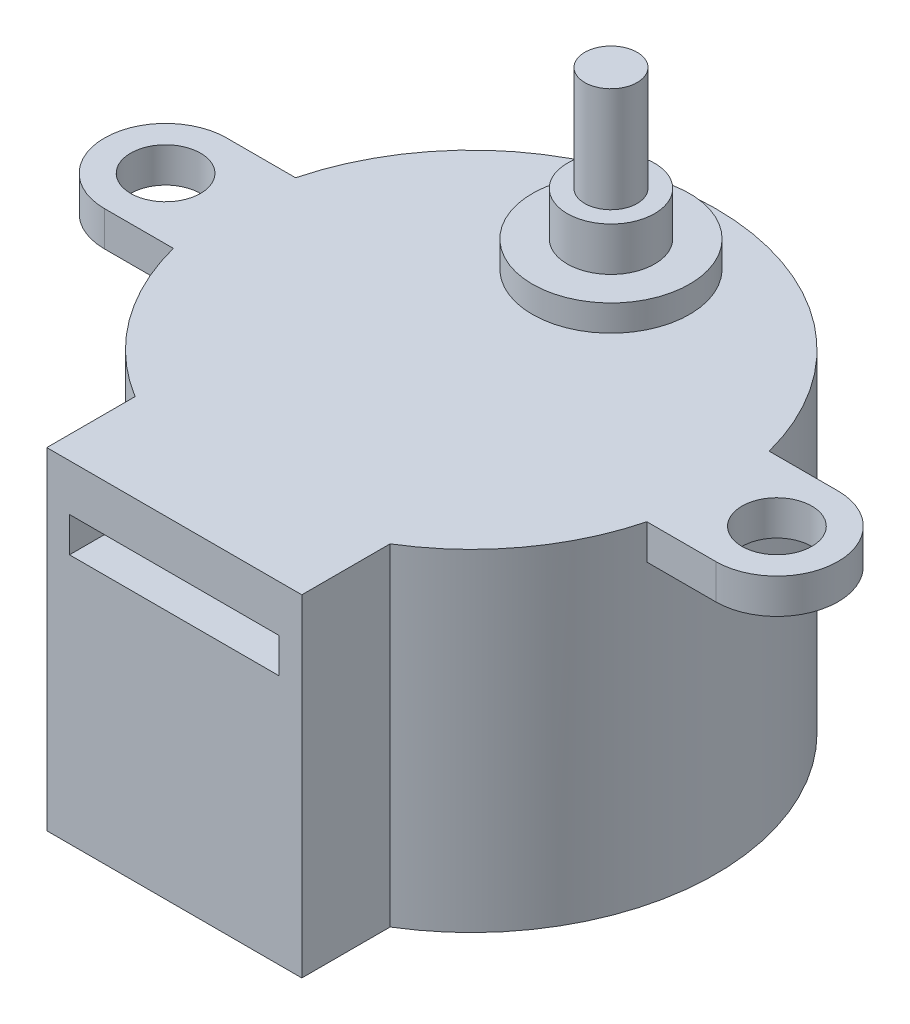
ISO-10303-21;
HEADER;
FILE_DESCRIPTION(('STEP AP214'),'2;1');
FILE_NAME('part.step','',(''),(''),'','','');
FILE_SCHEMA(('AUTOMOTIVE_DESIGN { 1 0 10303 214 1 1 1 1 }'));
ENDSEC;
DATA;
#1=APPLICATION_CONTEXT('core data for automotive mechanical design processes');
#2=APPLICATION_PROTOCOL_DEFINITION('international standard','automotive_design',2000,#1);
#3=PRODUCT_CONTEXT('',#1,'mechanical');
#4=PRODUCT('Part','Part','',(#3));
#5=PRODUCT_RELATED_PRODUCT_CATEGORY('part','',(#4));
#6=PRODUCT_DEFINITION_FORMATION('','',#4);
#7=PRODUCT_DEFINITION_CONTEXT('part definition',#1,'design');
#8=PRODUCT_DEFINITION('design','',#6,#7);
#9=PRODUCT_DEFINITION_SHAPE('','',#8);
#10=(LENGTH_UNIT() NAMED_UNIT(*) SI_UNIT(.MILLI.,.METRE.));
#11=(NAMED_UNIT(*) PLANE_ANGLE_UNIT() SI_UNIT($,.RADIAN.));
#12=(NAMED_UNIT(*) SI_UNIT($,.STERADIAN.) SOLID_ANGLE_UNIT());
#13=UNCERTAINTY_MEASURE_WITH_UNIT(LENGTH_MEASURE(1.E-05),#10,'distance_accuracy_value','');
#14=(GEOMETRIC_REPRESENTATION_CONTEXT(3) GLOBAL_UNCERTAINTY_ASSIGNED_CONTEXT((#13)) GLOBAL_UNIT_ASSIGNED_CONTEXT((#10,
#11,#12)) REPRESENTATION_CONTEXT('',''));
#15=CARTESIAN_POINT('',(0.,0.,0.));
#16=DIRECTION('',(0.,0.,1.));
#17=DIRECTION('',(1.,0.,0.));
#18=AXIS2_PLACEMENT_3D('',#15,#16,#17);
#19=CARTESIAN_POINT('',(0.,19.,0.));
#20=DIRECTION('',(0.,-1.,0.));
#21=DIRECTION('',(0.,0.,-1.));
#22=AXIS2_PLACEMENT_3D('',#19,#20,#21);
#23=CYLINDRICAL_SURFACE('',#22,14.);
#24=DIRECTION('',(0.,1.,0.));
#25=VECTOR('',#24,1.);
#26=CARTESIAN_POINT('',(13.555441711726,17.,3.5));
#27=LINE('',#26,#25);
#28=CARTESIAN_POINT('',(13.555441711726,17.,3.5));
#29=VERTEX_POINT('',#28);
#30=CARTESIAN_POINT('',(13.555441711726,19.,3.5));
#31=VERTEX_POINT('',#30);
#32=EDGE_CURVE('E238',#29,#31,#27,.T.);
#33=ORIENTED_EDGE('',*,*,#32,.T.);
#34=CARTESIAN_POINT('',(0.,19.,0.));
#35=DIRECTION('',(0.,1.,0.));
#36=DIRECTION('',(0.,0.,1.));
#37=AXIS2_PLACEMENT_3D('',#34,#35,#36);
#38=CIRCLE('',#37,14.);
#39=CARTESIAN_POINT('',(7.3,19.,11.9461290801665));
#40=VERTEX_POINT('',#39);
#41=EDGE_CURVE('E286',#40,#31,#38,.T.);
#42=ORIENTED_EDGE('',*,*,#41,.F.);
#43=DIRECTION('',(0.,-1.,0.));
#44=VECTOR('',#43,1.);
#45=CARTESIAN_POINT('',(7.3,19.,11.9461290801665));
#46=LINE('',#45,#44);
#47=CARTESIAN_POINT('',(7.3,0.,11.9461290801665));
#48=VERTEX_POINT('',#47);
#49=EDGE_CURVE('E52',#40,#48,#46,.T.);
#50=ORIENTED_EDGE('',*,*,#49,.T.);
#51=CARTESIAN_POINT('',(0.,0.,0.));
#52=DIRECTION('',(0.,1.,0.));
#53=DIRECTION('',(0.,0.,1.));
#54=AXIS2_PLACEMENT_3D('',#51,#52,#53);
#55=CIRCLE('',#54,14.);
#56=CARTESIAN_POINT('',(-7.3,0.,11.9461290801665));
#57=VERTEX_POINT('',#56);
#58=EDGE_CURVE('E299',#48,#57,#55,.T.);
#59=ORIENTED_EDGE('',*,*,#58,.T.);
#60=DIRECTION('',(0.,-1.,0.));
#61=VECTOR('',#60,1.);
#62=CARTESIAN_POINT('',(-7.3,19.,11.9461290801665));
#63=LINE('',#62,#61);
#64=CARTESIAN_POINT('',(-7.3,19.,11.9461290801665));
#65=VERTEX_POINT('',#64);
#66=EDGE_CURVE('E309',#65,#57,#63,.T.);
#67=ORIENTED_EDGE('',*,*,#66,.F.);
#68=CARTESIAN_POINT('',(-13.555441711726,19.,3.5));
#69=VERTEX_POINT('',#68);
#70=EDGE_CURVE('E284',#69,#65,#38,.T.);
#71=ORIENTED_EDGE('',*,*,#70,.F.);
#72=DIRECTION('',(0.,1.,0.));
#73=VECTOR('',#72,1.);
#74=CARTESIAN_POINT('',(-13.555441711726,17.,3.5));
#75=LINE('',#74,#73);
#76=CARTESIAN_POINT('',(-13.555441711726,17.,3.5));
#77=VERTEX_POINT('',#76);
#78=EDGE_CURVE('E275',#77,#69,#75,.T.);
#79=ORIENTED_EDGE('',*,*,#78,.F.);
#80=CARTESIAN_POINT('',(0.,17.,0.));
#81=DIRECTION('',(0.,1.,0.));
#82=DIRECTION('',(0.,0.,1.));
#83=AXIS2_PLACEMENT_3D('',#80,#81,#82);
#84=CIRCLE('',#83,14.);
#85=CARTESIAN_POINT('',(-13.555441711726,17.,-3.5));
#86=VERTEX_POINT('',#85);
#87=EDGE_CURVE('E259',#86,#77,#84,.T.);
#88=ORIENTED_EDGE('',*,*,#87,.F.);
#89=DIRECTION('',(0.,1.,0.));
#90=VECTOR('',#89,1.);
#91=CARTESIAN_POINT('',(-13.555441711726,17.,-3.5));
#92=LINE('',#91,#90);
#93=CARTESIAN_POINT('',(-13.555441711726,19.,-3.5));
#94=VERTEX_POINT('',#93);
#95=EDGE_CURVE('E271',#86,#94,#92,.T.);
#96=ORIENTED_EDGE('',*,*,#95,.T.);
#97=CARTESIAN_POINT('',(13.555441711726,19.,-3.5));
#98=VERTEX_POINT('',#97);
#99=EDGE_CURVE('E290',#98,#94,#38,.T.);
#100=ORIENTED_EDGE('',*,*,#99,.F.);
#101=DIRECTION('',(0.,1.,0.));
#102=VECTOR('',#101,1.);
#103=CARTESIAN_POINT('',(13.555441711726,17.,-3.5));
#104=LINE('',#103,#102);
#105=CARTESIAN_POINT('',(13.555441711726,17.,-3.5));
#106=VERTEX_POINT('',#105);
#107=EDGE_CURVE('E242',#106,#98,#104,.T.);
#108=ORIENTED_EDGE('',*,*,#107,.F.);
#109=CARTESIAN_POINT('',(0.,17.,0.));
#110=DIRECTION('',(0.,1.,0.));
#111=DIRECTION('',(0.,0.,1.));
#112=AXIS2_PLACEMENT_3D('',#109,#110,#111);
#113=CIRCLE('',#112,14.);
#114=EDGE_CURVE('E228',#29,#106,#113,.T.);
#115=ORIENTED_EDGE('',*,*,#114,.F.);
#116=EDGE_LOOP('',(#33,#42,#50,#59,#67,#71,#79,#88,#96,#100,#108,#115));
#117=FACE_BOUND('',#116,.T.);
#118=ADVANCED_FACE('F48',(#117),#23,.T.);
#119=CARTESIAN_POINT('',(-7.3,19.,0.));
#120=DIRECTION('',(-1.,0.,0.));
#121=DIRECTION('',(0.,0.,1.));
#122=AXIS2_PLACEMENT_3D('',#119,#120,#121);
#123=PLANE('',#122);
#124=DIRECTION('',(0.,0.,-1.));
#125=VECTOR('',#124,1.);
#126=CARTESIAN_POINT('',(-7.3,0.,0.));
#127=LINE('',#126,#125);
#128=CARTESIAN_POINT('',(-7.3,0.,17.));
#129=VERTEX_POINT('',#128);
#130=EDGE_CURVE('E302',#129,#57,#127,.T.);
#131=ORIENTED_EDGE('',*,*,#130,.F.);
#132=DIRECTION('',(0.,-1.,0.));
#133=VECTOR('',#132,1.);
#134=CARTESIAN_POINT('',(-7.3,19.,17.));
#135=LINE('',#134,#133);
#136=CARTESIAN_POINT('',(-7.3,19.,17.));
#137=VERTEX_POINT('',#136);
#138=EDGE_CURVE('E308',#137,#129,#135,.T.);
#139=ORIENTED_EDGE('',*,*,#138,.F.);
#140=DIRECTION('',(0.,0.,-1.));
#141=VECTOR('',#140,1.);
#142=CARTESIAN_POINT('',(-7.3,19.,0.));
#143=LINE('',#142,#141);
#144=EDGE_CURVE('E289',#137,#65,#143,.T.);
#145=ORIENTED_EDGE('',*,*,#144,.T.);
#146=ORIENTED_EDGE('',*,*,#66,.T.);
#147=EDGE_LOOP('',(#131,#139,#145,#146));
#148=FACE_BOUND('',#147,.T.);
#149=ADVANCED_FACE('F326',(#148),#123,.T.);
#150=CARTESIAN_POINT('',(0.,19.,17.));
#151=DIRECTION('',(0.,0.,1.));
#152=DIRECTION('',(1.,0.,0.));
#153=AXIS2_PLACEMENT_3D('',#150,#151,#152);
#154=PLANE('',#153);
#155=DIRECTION('',(0.,-1.,0.));
#156=VECTOR('',#155,1.);
#157=CARTESIAN_POINT('',(-6.,16.3324698263239,17.));
#158=LINE('',#157,#156);
#159=CARTESIAN_POINT('',(-6.,16.3324698263239,17.));
#160=VERTEX_POINT('',#159);
#161=CARTESIAN_POINT('',(-6.,14.3324698263239,17.));
#162=VERTEX_POINT('',#161);
#163=EDGE_CURVE('E65',#160,#162,#158,.T.);
#164=ORIENTED_EDGE('',*,*,#163,.F.);
#165=DIRECTION('',(-1.,0.,0.));
#166=VECTOR('',#165,1.);
#167=CARTESIAN_POINT('',(-6.,16.3324698263239,17.));
#168=LINE('',#167,#166);
#169=CARTESIAN_POINT('',(6.,16.3324698263239,17.));
#170=VERTEX_POINT('',#169);
#171=EDGE_CURVE('E184',#170,#160,#168,.T.);
#172=ORIENTED_EDGE('',*,*,#171,.F.);
#173=DIRECTION('',(0.,1.,0.));
#174=VECTOR('',#173,1.);
#175=CARTESIAN_POINT('',(6.,16.3324698263239,17.));
#176=LINE('',#175,#174);
#177=CARTESIAN_POINT('',(6.,14.3324698263239,17.));
#178=VERTEX_POINT('',#177);
#179=EDGE_CURVE('E187',#178,#170,#176,.T.);
#180=ORIENTED_EDGE('',*,*,#179,.F.);
#181=DIRECTION('',(1.,0.,0.));
#182=VECTOR('',#181,1.);
#183=CARTESIAN_POINT('',(-6.,14.3324698263239,17.));
#184=LINE('',#183,#182);
#185=EDGE_CURVE('E193',#162,#178,#184,.T.);
#186=ORIENTED_EDGE('',*,*,#185,.F.);
#187=EDGE_LOOP('',(#164,#172,#180,#186));
#188=FACE_BOUND('',#187,.T.);
#189=DIRECTION('',(-1.,0.,0.));
#190=VECTOR('',#189,1.);
#191=CARTESIAN_POINT('',(0.,0.,17.));
#192=LINE('',#191,#190);
#193=CARTESIAN_POINT('',(7.3,0.,17.));
#194=VERTEX_POINT('',#193);
#195=EDGE_CURVE('E285',#194,#129,#192,.T.);
#196=ORIENTED_EDGE('',*,*,#195,.F.);
#197=DIRECTION('',(0.,-1.,0.));
#198=VECTOR('',#197,1.);
#199=CARTESIAN_POINT('',(7.3,19.,17.));
#200=LINE('',#199,#198);
#201=CARTESIAN_POINT('',(7.3,19.,17.));
#202=VERTEX_POINT('',#201);
#203=EDGE_CURVE('E296',#202,#194,#200,.T.);
#204=ORIENTED_EDGE('',*,*,#203,.F.);
#205=DIRECTION('',(-1.,0.,0.));
#206=VECTOR('',#205,1.);
#207=CARTESIAN_POINT('',(0.,19.,17.));
#208=LINE('',#207,#206);
#209=EDGE_CURVE('E293',#202,#137,#208,.T.);
#210=ORIENTED_EDGE('',*,*,#209,.T.);
#211=ORIENTED_EDGE('',*,*,#138,.T.);
#212=EDGE_LOOP('',(#196,#204,#210,#211));
#213=FACE_BOUND('',#212,.T.);
#214=ADVANCED_FACE('F324',(#188,#213),#154,.T.);
#215=CARTESIAN_POINT('',(7.3,19.,0.));
#216=DIRECTION('',(-1.,0.,0.));
#217=DIRECTION('',(0.,0.,1.));
#218=AXIS2_PLACEMENT_3D('',#215,#216,#217);
#219=PLANE('',#218);
#220=DIRECTION('',(0.,0.,-1.));
#221=VECTOR('',#220,1.);
#222=CARTESIAN_POINT('',(7.3,0.,0.));
#223=LINE('',#222,#221);
#224=EDGE_CURVE('E274',#194,#48,#223,.T.);
#225=ORIENTED_EDGE('',*,*,#224,.T.);
#226=ORIENTED_EDGE('',*,*,#49,.F.);
#227=DIRECTION('',(0.,0.,-1.));
#228=VECTOR('',#227,1.);
#229=CARTESIAN_POINT('',(7.3,19.,0.));
#230=LINE('',#229,#228);
#231=EDGE_CURVE('E281',#202,#40,#230,.T.);
#232=ORIENTED_EDGE('',*,*,#231,.F.);
#233=ORIENTED_EDGE('',*,*,#203,.T.);
#234=EDGE_LOOP('',(#225,#226,#232,#233));
#235=FACE_BOUND('',#234,.T.);
#236=ADVANCED_FACE('F50',(#235),#219,.F.);
#237=CARTESIAN_POINT('',(0.,0.,0.));
#238=DIRECTION('',(0.,1.,0.));
#239=DIRECTION('',(0.,0.,1.));
#240=AXIS2_PLACEMENT_3D('',#237,#238,#239);
#241=PLANE('',#240);
#242=ORIENTED_EDGE('',*,*,#130,.T.);
#243=ORIENTED_EDGE('',*,*,#58,.F.);
#244=ORIENTED_EDGE('',*,*,#224,.F.);
#245=ORIENTED_EDGE('',*,*,#195,.T.);
#246=EDGE_LOOP('',(#242,#243,#244,#245));
#247=FACE_BOUND('',#246,.T.);
#248=ADVANCED_FACE('F320',(#247),#241,.F.);
#249=CARTESIAN_POINT('',(0.,19.,0.));
#250=DIRECTION('',(0.,1.,0.));
#251=DIRECTION('',(0.,0.,1.));
#252=AXIS2_PLACEMENT_3D('',#249,#250,#251);
#253=PLANE('',#252);
#254=CARTESIAN_POINT('',(0.,19.,-8.));
#255=DIRECTION('',(0.,1.,0.));
#256=DIRECTION('',(0.,0.,1.));
#257=AXIS2_PLACEMENT_3D('',#254,#255,#256);
#258=CIRCLE('',#257,4.5);
#259=CARTESIAN_POINT('',(0.,19.,-3.5));
#260=VERTEX_POINT('',#259);
#261=EDGE_CURVE('E208',#260,#260,#258,.T.);
#262=ORIENTED_EDGE('',*,*,#261,.F.);
#263=EDGE_LOOP('',(#262));
#264=FACE_BOUND('',#263,.T.);
#265=ORIENTED_EDGE('',*,*,#231,.T.);
#266=ORIENTED_EDGE('',*,*,#41,.T.);
#267=DIRECTION('',(-1.,0.,0.));
#268=VECTOR('',#267,1.);
#269=CARTESIAN_POINT('',(0.,19.,3.5));
#270=LINE('',#269,#268);
#271=CARTESIAN_POINT('',(17.5,19.,3.5));
#272=VERTEX_POINT('',#271);
#273=EDGE_CURVE('E233',#272,#31,#270,.T.);
#274=ORIENTED_EDGE('',*,*,#273,.F.);
#275=CARTESIAN_POINT('',(17.5,19.,0.));
#276=DIRECTION('',(0.,1.,0.));
#277=DIRECTION('',(0.,0.,1.));
#278=AXIS2_PLACEMENT_3D('',#275,#276,#277);
#279=CIRCLE('',#278,3.5);
#280=CARTESIAN_POINT('',(17.5,19.,-3.5));
#281=VERTEX_POINT('',#280);
#282=EDGE_CURVE('E235',#272,#281,#279,.T.);
#283=ORIENTED_EDGE('',*,*,#282,.T.);
#284=DIRECTION('',(-1.,0.,0.));
#285=VECTOR('',#284,1.);
#286=CARTESIAN_POINT('',(0.,19.,-3.5));
#287=LINE('',#286,#285);
#288=EDGE_CURVE('E73',#281,#98,#287,.T.);
#289=ORIENTED_EDGE('',*,*,#288,.T.);
#290=ORIENTED_EDGE('',*,*,#99,.T.);
#291=DIRECTION('',(1.,0.,0.));
#292=VECTOR('',#291,1.);
#293=CARTESIAN_POINT('',(0.,19.,-3.5));
#294=LINE('',#293,#292);
#295=CARTESIAN_POINT('',(-17.5,19.,-3.5));
#296=VERTEX_POINT('',#295);
#297=EDGE_CURVE('E264',#296,#94,#294,.T.);
#298=ORIENTED_EDGE('',*,*,#297,.F.);
#299=CARTESIAN_POINT('',(-17.5,19.,0.));
#300=DIRECTION('',(0.,1.,0.));
#301=DIRECTION('',(0.,0.,1.));
#302=AXIS2_PLACEMENT_3D('',#299,#300,#301);
#303=CIRCLE('',#302,3.5);
#304=CARTESIAN_POINT('',(-17.5,19.,3.5));
#305=VERTEX_POINT('',#304);
#306=EDGE_CURVE('E267',#296,#305,#303,.T.);
#307=ORIENTED_EDGE('',*,*,#306,.T.);
#308=DIRECTION('',(1.,0.,0.));
#309=VECTOR('',#308,1.);
#310=CARTESIAN_POINT('',(0.,19.,3.5));
#311=LINE('',#310,#309);
#312=EDGE_CURVE('E251',#305,#69,#311,.T.);
#313=ORIENTED_EDGE('',*,*,#312,.T.);
#314=ORIENTED_EDGE('',*,*,#70,.T.);
#315=ORIENTED_EDGE('',*,*,#144,.F.);
#316=ORIENTED_EDGE('',*,*,#209,.F.);
#317=EDGE_LOOP('',(#265,#266,#274,#283,#289,#290,#298,#307,#313,#314,#315,#316));
#318=FACE_BOUND('',#317,.T.);
#319=CARTESIAN_POINT('',(-17.5,19.,0.));
#320=DIRECTION('',(0.,1.,0.));
#321=DIRECTION('',(0.,0.,1.));
#322=AXIS2_PLACEMENT_3D('',#319,#320,#321);
#323=CIRCLE('',#322,2.);
#324=CARTESIAN_POINT('',(-17.5,19.,2.));
#325=VERTEX_POINT('',#324);
#326=EDGE_CURVE('E241',#325,#325,#323,.T.);
#327=ORIENTED_EDGE('',*,*,#326,.F.);
#328=EDGE_LOOP('',(#327));
#329=FACE_BOUND('',#328,.T.);
#330=CARTESIAN_POINT('',(17.5,19.,0.));
#331=DIRECTION('',(0.,1.,0.));
#332=DIRECTION('',(0.,0.,1.));
#333=AXIS2_PLACEMENT_3D('',#330,#331,#332);
#334=CIRCLE('',#333,2.);
#335=CARTESIAN_POINT('',(17.5,19.,2.));
#336=VERTEX_POINT('',#335);
#337=EDGE_CURVE('E214',#336,#336,#334,.T.);
#338=ORIENTED_EDGE('',*,*,#337,.F.);
#339=EDGE_LOOP('',(#338));
#340=FACE_BOUND('',#339,.T.);
#341=ADVANCED_FACE('F338',(#264,#318,#329,#340),#253,.T.);
#342=CARTESIAN_POINT('',(0.,17.,-3.5));
#343=DIRECTION('',(0.,0.,1.));
#344=DIRECTION('',(1.,0.,0.));
#345=AXIS2_PLACEMENT_3D('',#342,#343,#344);
#346=PLANE('',#345);
#347=ORIENTED_EDGE('',*,*,#297,.T.);
#348=ORIENTED_EDGE('',*,*,#95,.F.);
#349=DIRECTION('',(1.,0.,0.));
#350=VECTOR('',#349,1.);
#351=CARTESIAN_POINT('',(0.,17.,-3.5));
#352=LINE('',#351,#350);
#353=CARTESIAN_POINT('',(-17.5,17.,-3.5));
#354=VERTEX_POINT('',#353);
#355=EDGE_CURVE('E250',#354,#86,#352,.T.);
#356=ORIENTED_EDGE('',*,*,#355,.F.);
#357=DIRECTION('',(0.,1.,0.));
#358=VECTOR('',#357,1.);
#359=CARTESIAN_POINT('',(-17.5,17.,-3.5));
#360=LINE('',#359,#358);
#361=EDGE_CURVE('E261',#354,#296,#360,.T.);
#362=ORIENTED_EDGE('',*,*,#361,.T.);
#363=EDGE_LOOP('',(#347,#348,#356,#362));
#364=FACE_BOUND('',#363,.T.);
#365=ADVANCED_FACE('F341',(#364),#346,.F.);
#366=CARTESIAN_POINT('',(0.,17.,3.5));
#367=DIRECTION('',(0.,0.,1.));
#368=DIRECTION('',(1.,0.,0.));
#369=AXIS2_PLACEMENT_3D('',#366,#367,#368);
#370=PLANE('',#369);
#371=ORIENTED_EDGE('',*,*,#312,.F.);
#372=DIRECTION('',(0.,1.,0.));
#373=VECTOR('',#372,1.);
#374=CARTESIAN_POINT('',(-17.5,17.,3.5));
#375=LINE('',#374,#373);
#376=CARTESIAN_POINT('',(-17.5,17.,3.5));
#377=VERTEX_POINT('',#376);
#378=EDGE_CURVE('E278',#377,#305,#375,.T.);
#379=ORIENTED_EDGE('',*,*,#378,.F.);
#380=DIRECTION('',(1.,0.,0.));
#381=VECTOR('',#380,1.);
#382=CARTESIAN_POINT('',(0.,17.,3.5));
#383=LINE('',#382,#381);
#384=EDGE_CURVE('E256',#377,#77,#383,.T.);
#385=ORIENTED_EDGE('',*,*,#384,.T.);
#386=ORIENTED_EDGE('',*,*,#78,.T.);
#387=EDGE_LOOP('',(#371,#379,#385,#386));
#388=FACE_BOUND('',#387,.T.);
#389=ADVANCED_FACE('F347',(#388),#370,.T.);
#390=CARTESIAN_POINT('',(-17.5,17.,0.));
#391=DIRECTION('',(0.,1.,0.));
#392=DIRECTION('',(0.,0.,1.));
#393=AXIS2_PLACEMENT_3D('',#390,#391,#392);
#394=CYLINDRICAL_SURFACE('',#393,2.);
#395=CARTESIAN_POINT('',(-17.5,17.,0.));
#396=DIRECTION('',(0.,1.,0.));
#397=DIRECTION('',(0.,0.,1.));
#398=AXIS2_PLACEMENT_3D('',#395,#396,#397);
#399=CIRCLE('',#398,2.);
#400=CARTESIAN_POINT('',(-17.5,17.,2.));
#401=VERTEX_POINT('',#400);
#402=EDGE_CURVE('E247',#401,#401,#399,.T.);
#403=ORIENTED_EDGE('',*,*,#402,.F.);
#404=EDGE_LOOP('',(#403));
#405=FACE_BOUND('',#404,.T.);
#406=ORIENTED_EDGE('',*,*,#326,.T.);
#407=EDGE_LOOP('',(#406));
#408=FACE_BOUND('',#407,.T.);
#409=ADVANCED_FACE('F343',(#405,#408),#394,.F.);
#410=CARTESIAN_POINT('',(-17.5,17.,0.));
#411=DIRECTION('',(0.,1.,0.));
#412=DIRECTION('',(0.,0.,1.));
#413=AXIS2_PLACEMENT_3D('',#410,#411,#412);
#414=CYLINDRICAL_SURFACE('',#413,3.5);
#415=ORIENTED_EDGE('',*,*,#306,.F.);
#416=ORIENTED_EDGE('',*,*,#361,.F.);
#417=CARTESIAN_POINT('',(-17.5,17.,0.));
#418=DIRECTION('',(0.,1.,0.));
#419=DIRECTION('',(0.,0.,1.));
#420=AXIS2_PLACEMENT_3D('',#417,#418,#419);
#421=CIRCLE('',#420,3.5);
#422=EDGE_CURVE('E253',#354,#377,#421,.T.);
#423=ORIENTED_EDGE('',*,*,#422,.T.);
#424=ORIENTED_EDGE('',*,*,#378,.T.);
#425=EDGE_LOOP('',(#415,#416,#423,#424));
#426=FACE_BOUND('',#425,.T.);
#427=ADVANCED_FACE('F346',(#426),#414,.T.);
#428=CARTESIAN_POINT('',(0.,17.,0.));
#429=DIRECTION('',(0.,1.,0.));
#430=DIRECTION('',(0.,0.,1.));
#431=AXIS2_PLACEMENT_3D('',#428,#429,#430);
#432=PLANE('',#431);
#433=ORIENTED_EDGE('',*,*,#402,.T.);
#434=EDGE_LOOP('',(#433));
#435=FACE_BOUND('',#434,.T.);
#436=ORIENTED_EDGE('',*,*,#355,.T.);
#437=ORIENTED_EDGE('',*,*,#87,.T.);
#438=ORIENTED_EDGE('',*,*,#384,.F.);
#439=ORIENTED_EDGE('',*,*,#422,.F.);
#440=EDGE_LOOP('',(#436,#437,#438,#439));
#441=FACE_BOUND('',#440,.T.);
#442=ADVANCED_FACE('F354',(#435,#441),#432,.F.);
#443=CARTESIAN_POINT('',(0.,17.,3.5));
#444=DIRECTION('',(0.,0.,-1.));
#445=DIRECTION('',(-1.,0.,0.));
#446=AXIS2_PLACEMENT_3D('',#443,#444,#445);
#447=PLANE('',#446);
#448=ORIENTED_EDGE('',*,*,#273,.T.);
#449=ORIENTED_EDGE('',*,*,#32,.F.);
#450=DIRECTION('',(-1.,0.,0.));
#451=VECTOR('',#450,1.);
#452=CARTESIAN_POINT('',(0.,17.,3.5));
#453=LINE('',#452,#451);
#454=CARTESIAN_POINT('',(17.5,17.,3.5));
#455=VERTEX_POINT('',#454);
#456=EDGE_CURVE('E220',#455,#29,#453,.T.);
#457=ORIENTED_EDGE('',*,*,#456,.F.);
#458=DIRECTION('',(0.,1.,0.));
#459=VECTOR('',#458,1.);
#460=CARTESIAN_POINT('',(17.5,17.,3.5));
#461=LINE('',#460,#459);
#462=EDGE_CURVE('E230',#455,#272,#461,.T.);
#463=ORIENTED_EDGE('',*,*,#462,.T.);
#464=EDGE_LOOP('',(#448,#449,#457,#463));
#465=FACE_BOUND('',#464,.T.);
#466=ADVANCED_FACE('F361',(#465),#447,.F.);
#467=CARTESIAN_POINT('',(0.,17.,-3.5));
#468=DIRECTION('',(0.,0.,-1.));
#469=DIRECTION('',(-1.,0.,0.));
#470=AXIS2_PLACEMENT_3D('',#467,#468,#469);
#471=PLANE('',#470);
#472=ORIENTED_EDGE('',*,*,#288,.F.);
#473=DIRECTION('',(0.,1.,0.));
#474=VECTOR('',#473,1.);
#475=CARTESIAN_POINT('',(17.5,17.,-3.5));
#476=LINE('',#475,#474);
#477=CARTESIAN_POINT('',(17.5,17.,-3.5));
#478=VERTEX_POINT('',#477);
#479=EDGE_CURVE('E244',#478,#281,#476,.T.);
#480=ORIENTED_EDGE('',*,*,#479,.F.);
#481=DIRECTION('',(-1.,0.,0.));
#482=VECTOR('',#481,1.);
#483=CARTESIAN_POINT('',(0.,17.,-3.5));
#484=LINE('',#483,#482);
#485=EDGE_CURVE('E225',#478,#106,#484,.T.);
#486=ORIENTED_EDGE('',*,*,#485,.T.);
#487=ORIENTED_EDGE('',*,*,#107,.T.);
#488=EDGE_LOOP('',(#472,#480,#486,#487));
#489=FACE_BOUND('',#488,.T.);
#490=ADVANCED_FACE('F367',(#489),#471,.T.);
#491=CARTESIAN_POINT('',(17.5,17.,0.));
#492=DIRECTION('',(0.,1.,0.));
#493=DIRECTION('',(0.,0.,1.));
#494=AXIS2_PLACEMENT_3D('',#491,#492,#493);
#495=CYLINDRICAL_SURFACE('',#494,2.);
#496=CARTESIAN_POINT('',(17.5,17.,0.));
#497=DIRECTION('',(0.,1.,0.));
#498=DIRECTION('',(0.,0.,1.));
#499=AXIS2_PLACEMENT_3D('',#496,#497,#498);
#500=CIRCLE('',#499,2.);
#501=CARTESIAN_POINT('',(17.5,17.,2.));
#502=VERTEX_POINT('',#501);
#503=EDGE_CURVE('E217',#502,#502,#500,.T.);
#504=ORIENTED_EDGE('',*,*,#503,.F.);
#505=EDGE_LOOP('',(#504));
#506=FACE_BOUND('',#505,.T.);
#507=ORIENTED_EDGE('',*,*,#337,.T.);
#508=EDGE_LOOP('',(#507));
#509=FACE_BOUND('',#508,.T.);
#510=ADVANCED_FACE('F363',(#506,#509),#495,.F.);
#511=CARTESIAN_POINT('',(17.5,17.,0.));
#512=DIRECTION('',(0.,1.,0.));
#513=DIRECTION('',(0.,0.,1.));
#514=AXIS2_PLACEMENT_3D('',#511,#512,#513);
#515=CYLINDRICAL_SURFACE('',#514,3.5);
#516=ORIENTED_EDGE('',*,*,#282,.F.);
#517=ORIENTED_EDGE('',*,*,#462,.F.);
#518=CARTESIAN_POINT('',(17.5,17.,0.));
#519=DIRECTION('',(0.,1.,0.));
#520=DIRECTION('',(0.,0.,1.));
#521=AXIS2_PLACEMENT_3D('',#518,#519,#520);
#522=CIRCLE('',#521,3.5);
#523=EDGE_CURVE('E222',#455,#478,#522,.T.);
#524=ORIENTED_EDGE('',*,*,#523,.T.);
#525=ORIENTED_EDGE('',*,*,#479,.T.);
#526=EDGE_LOOP('',(#516,#517,#524,#525));
#527=FACE_BOUND('',#526,.T.);
#528=ADVANCED_FACE('F366',(#527),#515,.T.);
#529=CARTESIAN_POINT('',(0.,17.,0.));
#530=DIRECTION('',(0.,1.,0.));
#531=DIRECTION('',(0.,0.,1.));
#532=AXIS2_PLACEMENT_3D('',#529,#530,#531);
#533=PLANE('',#532);
#534=ORIENTED_EDGE('',*,*,#503,.T.);
#535=EDGE_LOOP('',(#534));
#536=FACE_BOUND('',#535,.T.);
#537=ORIENTED_EDGE('',*,*,#456,.T.);
#538=ORIENTED_EDGE('',*,*,#114,.T.);
#539=ORIENTED_EDGE('',*,*,#485,.F.);
#540=ORIENTED_EDGE('',*,*,#523,.F.);
#541=EDGE_LOOP('',(#537,#538,#539,#540));
#542=FACE_BOUND('',#541,.T.);
#543=ADVANCED_FACE('F374',(#536,#542),#533,.F.);
#544=CARTESIAN_POINT('',(0.,20.5,-8.));
#545=DIRECTION('',(0.,-1.,0.));
#546=DIRECTION('',(0.,0.,-1.));
#547=AXIS2_PLACEMENT_3D('',#544,#545,#546);
#548=CYLINDRICAL_SURFACE('',#547,4.5);
#549=CARTESIAN_POINT('',(0.,20.5,-8.));
#550=DIRECTION('',(0.,1.,0.));
#551=DIRECTION('',(0.,0.,1.));
#552=AXIS2_PLACEMENT_3D('',#549,#550,#551);
#553=CIRCLE('',#552,4.5);
#554=CARTESIAN_POINT('',(0.,20.5,-3.5));
#555=VERTEX_POINT('',#554);
#556=EDGE_CURVE('E211',#555,#555,#553,.T.);
#557=ORIENTED_EDGE('',*,*,#556,.F.);
#558=EDGE_LOOP('',(#557));
#559=FACE_BOUND('',#558,.T.);
#560=ORIENTED_EDGE('',*,*,#261,.T.);
#561=EDGE_LOOP('',(#560));
#562=FACE_BOUND('',#561,.T.);
#563=ADVANCED_FACE('F381',(#559,#562),#548,.T.);
#564=CARTESIAN_POINT('',(0.,20.5,-8.));
#565=DIRECTION('',(0.,1.,0.));
#566=DIRECTION('',(0.,0.,1.));
#567=AXIS2_PLACEMENT_3D('',#564,#565,#566);
#568=PLANE('',#567);
#569=CARTESIAN_POINT('',(0.,20.5,-8.));
#570=DIRECTION('',(0.,1.,0.));
#571=DIRECTION('',(0.,0.,1.));
#572=AXIS2_PLACEMENT_3D('',#569,#570,#571);
#573=CIRCLE('',#572,2.5);
#574=CARTESIAN_POINT('',(0.,20.5,-5.5));
#575=VERTEX_POINT('',#574);
#576=EDGE_CURVE('E57',#575,#575,#573,.T.);
#577=ORIENTED_EDGE('',*,*,#576,.F.);
#578=EDGE_LOOP('',(#577));
#579=FACE_BOUND('',#578,.T.);
#580=ORIENTED_EDGE('',*,*,#556,.T.);
#581=EDGE_LOOP('',(#580));
#582=FACE_BOUND('',#581,.T.);
#583=ADVANCED_FACE('F385',(#579,#582),#568,.T.);
#584=CARTESIAN_POINT('',(0.,23.,-8.));
#585=DIRECTION('',(0.,-1.,0.));
#586=DIRECTION('',(0.,0.,-1.));
#587=AXIS2_PLACEMENT_3D('',#584,#585,#586);
#588=CYLINDRICAL_SURFACE('',#587,2.5);
#589=CARTESIAN_POINT('',(0.,23.,-8.));
#590=DIRECTION('',(0.,1.,0.));
#591=DIRECTION('',(0.,0.,1.));
#592=AXIS2_PLACEMENT_3D('',#589,#590,#591);
#593=CIRCLE('',#592,2.5);
#594=CARTESIAN_POINT('',(0.,23.,-5.5));
#595=VERTEX_POINT('',#594);
#596=EDGE_CURVE('E204',#595,#595,#593,.T.);
#597=ORIENTED_EDGE('',*,*,#596,.F.);
#598=EDGE_LOOP('',(#597));
#599=FACE_BOUND('',#598,.T.);
#600=ORIENTED_EDGE('',*,*,#576,.T.);
#601=EDGE_LOOP('',(#600));
#602=FACE_BOUND('',#601,.T.);
#603=ADVANCED_FACE('F389',(#599,#602),#588,.T.);
#604=CARTESIAN_POINT('',(0.,23.,-8.));
#605=DIRECTION('',(0.,1.,0.));
#606=DIRECTION('',(0.,0.,1.));
#607=AXIS2_PLACEMENT_3D('',#604,#605,#606);
#608=PLANE('',#607);
#609=CARTESIAN_POINT('',(0.,23.,-8.));
#610=DIRECTION('',(0.,1.,0.));
#611=DIRECTION('',(0.,0.,1.));
#612=AXIS2_PLACEMENT_3D('',#609,#610,#611);
#613=CIRCLE('',#612,1.5);
#614=CARTESIAN_POINT('',(0.,23.,-6.5));
#615=VERTEX_POINT('',#614);
#616=EDGE_CURVE('E12',#615,#615,#613,.T.);
#617=ORIENTED_EDGE('',*,*,#616,.F.);
#618=EDGE_LOOP('',(#617));
#619=FACE_BOUND('',#618,.T.);
#620=ORIENTED_EDGE('',*,*,#596,.T.);
#621=EDGE_LOOP('',(#620));
#622=FACE_BOUND('',#621,.T.);
#623=ADVANCED_FACE('F393',(#619,#622),#608,.T.);
#624=CARTESIAN_POINT('',(0.,29.,-8.));
#625=DIRECTION('',(0.,-1.,0.));
#626=DIRECTION('',(0.,0.,-1.));
#627=AXIS2_PLACEMENT_3D('',#624,#625,#626);
#628=CYLINDRICAL_SURFACE('',#627,1.5);
#629=CARTESIAN_POINT('',(0.,29.,-8.));
#630=DIRECTION('',(0.,1.,0.));
#631=DIRECTION('',(0.,0.,1.));
#632=AXIS2_PLACEMENT_3D('',#629,#630,#631);
#633=CIRCLE('',#632,1.5);
#634=CARTESIAN_POINT('',(0.,29.,-6.5));
#635=VERTEX_POINT('',#634);
#636=EDGE_CURVE('E199',#635,#635,#633,.T.);
#637=ORIENTED_EDGE('',*,*,#636,.F.);
#638=EDGE_LOOP('',(#637));
#639=FACE_BOUND('',#638,.T.);
#640=ORIENTED_EDGE('',*,*,#616,.T.);
#641=EDGE_LOOP('',(#640));
#642=FACE_BOUND('',#641,.T.);
#643=ADVANCED_FACE('F397',(#639,#642),#628,.T.);
#644=CARTESIAN_POINT('',(0.,29.,-8.));
#645=DIRECTION('',(0.,1.,0.));
#646=DIRECTION('',(0.,0.,1.));
#647=AXIS2_PLACEMENT_3D('',#644,#645,#646);
#648=PLANE('',#647);
#649=ORIENTED_EDGE('',*,*,#636,.T.);
#650=EDGE_LOOP('',(#649));
#651=FACE_BOUND('',#650,.T.);
#652=ADVANCED_FACE('F401',(#651),#648,.T.);
#653=CARTESIAN_POINT('',(-6.,16.3324698263239,13.));
#654=DIRECTION('',(-1.,0.,0.));
#655=DIRECTION('',(0.,-1.,0.));
#656=AXIS2_PLACEMENT_3D('',#653,#654,#655);
#657=PLANE('',#656);
#658=ORIENTED_EDGE('',*,*,#163,.T.);
#659=DIRECTION('',(0.,0.,1.));
#660=VECTOR('',#659,1.);
#661=CARTESIAN_POINT('',(-6.,14.3324698263239,13.));
#662=LINE('',#661,#660);
#663=CARTESIAN_POINT('',(-6.,14.3324698263239,13.));
#664=VERTEX_POINT('',#663);
#665=EDGE_CURVE('E162',#664,#162,#662,.T.);
#666=ORIENTED_EDGE('',*,*,#665,.F.);
#667=DIRECTION('',(0.,-1.,0.));
#668=VECTOR('',#667,1.);
#669=CARTESIAN_POINT('',(-6.,16.3324698263239,13.));
#670=LINE('',#669,#668);
#671=CARTESIAN_POINT('',(-6.,16.3324698263239,13.));
#672=VERTEX_POINT('',#671);
#673=EDGE_CURVE('E166',#672,#664,#670,.T.);
#674=ORIENTED_EDGE('',*,*,#673,.F.);
#675=DIRECTION('',(0.,0.,1.));
#676=VECTOR('',#675,1.);
#677=CARTESIAN_POINT('',(-6.,16.3324698263239,13.));
#678=LINE('',#677,#676);
#679=EDGE_CURVE('E197',#672,#160,#678,.T.);
#680=ORIENTED_EDGE('',*,*,#679,.T.);
#681=EDGE_LOOP('',(#658,#666,#674,#680));
#682=FACE_BOUND('',#681,.T.);
#683=ADVANCED_FACE('F164',(#682),#657,.F.);
#684=CARTESIAN_POINT('',(-6.,16.3324698263239,13.));
#685=DIRECTION('',(0.,1.,0.));
#686=DIRECTION('',(0.,0.,1.));
#687=AXIS2_PLACEMENT_3D('',#684,#685,#686);
#688=PLANE('',#687);
#689=ORIENTED_EDGE('',*,*,#171,.T.);
#690=ORIENTED_EDGE('',*,*,#679,.F.);
#691=DIRECTION('',(-1.,0.,0.));
#692=VECTOR('',#691,1.);
#693=CARTESIAN_POINT('',(-6.,16.3324698263239,13.));
#694=LINE('',#693,#692);
#695=CARTESIAN_POINT('',(6.,16.3324698263239,13.));
#696=VERTEX_POINT('',#695);
#697=EDGE_CURVE('E172',#696,#672,#694,.T.);
#698=ORIENTED_EDGE('',*,*,#697,.F.);
#699=DIRECTION('',(0.,0.,1.));
#700=VECTOR('',#699,1.);
#701=CARTESIAN_POINT('',(6.,16.3324698263239,13.));
#702=LINE('',#701,#700);
#703=EDGE_CURVE('E200',#696,#170,#702,.T.);
#704=ORIENTED_EDGE('',*,*,#703,.T.);
#705=EDGE_LOOP('',(#689,#690,#698,#704));
#706=FACE_BOUND('',#705,.T.);
#707=ADVANCED_FACE('F408',(#706),#688,.F.);
#708=CARTESIAN_POINT('',(6.,16.3324698263239,13.));
#709=DIRECTION('',(1.,0.,0.));
#710=DIRECTION('',(0.,1.,0.));
#711=AXIS2_PLACEMENT_3D('',#708,#709,#710);
#712=PLANE('',#711);
#713=ORIENTED_EDGE('',*,*,#179,.T.);
#714=ORIENTED_EDGE('',*,*,#703,.F.);
#715=DIRECTION('',(0.,1.,0.));
#716=VECTOR('',#715,1.);
#717=CARTESIAN_POINT('',(6.,16.3324698263239,13.));
#718=LINE('',#717,#716);
#719=CARTESIAN_POINT('',(6.,14.3324698263239,13.));
#720=VERTEX_POINT('',#719);
#721=EDGE_CURVE('E180',#720,#696,#718,.T.);
#722=ORIENTED_EDGE('',*,*,#721,.F.);
#723=DIRECTION('',(0.,0.,1.));
#724=VECTOR('',#723,1.);
#725=CARTESIAN_POINT('',(6.,14.3324698263239,13.));
#726=LINE('',#725,#724);
#727=EDGE_CURVE('E171',#720,#178,#726,.T.);
#728=ORIENTED_EDGE('',*,*,#727,.T.);
#729=EDGE_LOOP('',(#713,#714,#722,#728));
#730=FACE_BOUND('',#729,.T.);
#731=ADVANCED_FACE('F411',(#730),#712,.F.);
#732=CARTESIAN_POINT('',(-6.,14.3324698263239,13.));
#733=DIRECTION('',(0.,-1.,0.));
#734=DIRECTION('',(1.,0.,0.));
#735=AXIS2_PLACEMENT_3D('',#732,#733,#734);
#736=PLANE('',#735);
#737=ORIENTED_EDGE('',*,*,#185,.T.);
#738=ORIENTED_EDGE('',*,*,#727,.F.);
#739=DIRECTION('',(1.,0.,0.));
#740=VECTOR('',#739,1.);
#741=CARTESIAN_POINT('',(-6.,14.3324698263239,13.));
#742=LINE('',#741,#740);
#743=EDGE_CURVE('E175',#664,#720,#742,.T.);
#744=ORIENTED_EDGE('',*,*,#743,.F.);
#745=ORIENTED_EDGE('',*,*,#665,.T.);
#746=EDGE_LOOP('',(#737,#738,#744,#745));
#747=FACE_BOUND('',#746,.T.);
#748=ADVANCED_FACE('F176',(#747),#736,.F.);
#749=CARTESIAN_POINT('',(0.,0.,13.));
#750=DIRECTION('',(0.,0.,1.));
#751=DIRECTION('',(1.,0.,0.));
#752=AXIS2_PLACEMENT_3D('',#749,#750,#751);
#753=PLANE('',#752);
#754=ORIENTED_EDGE('',*,*,#673,.T.);
#755=ORIENTED_EDGE('',*,*,#743,.T.);
#756=ORIENTED_EDGE('',*,*,#721,.T.);
#757=ORIENTED_EDGE('',*,*,#697,.T.);
#758=EDGE_LOOP('',(#754,#755,#756,#757));
#759=FACE_BOUND('',#758,.T.);
#760=ADVANCED_FACE('F182',(#759),#753,.T.);
#761=CLOSED_SHELL('',(#118,#149,#214,#236,#248,#341,#365,#389,#409,#427,#442,#466,#490,#510,
#528,#543,#563,#583,#603,#623,#643,#652,#683,#707,#731,#748,#760));
#762=MANIFOLD_SOLID_BREP('B2',#761);
#763=ADVANCED_BREP_SHAPE_REPRESENTATION('',(#18,#762),#14);
#764=SHAPE_DEFINITION_REPRESENTATION(#9,#763);
ENDSEC;
END-ISO-10303-21;
